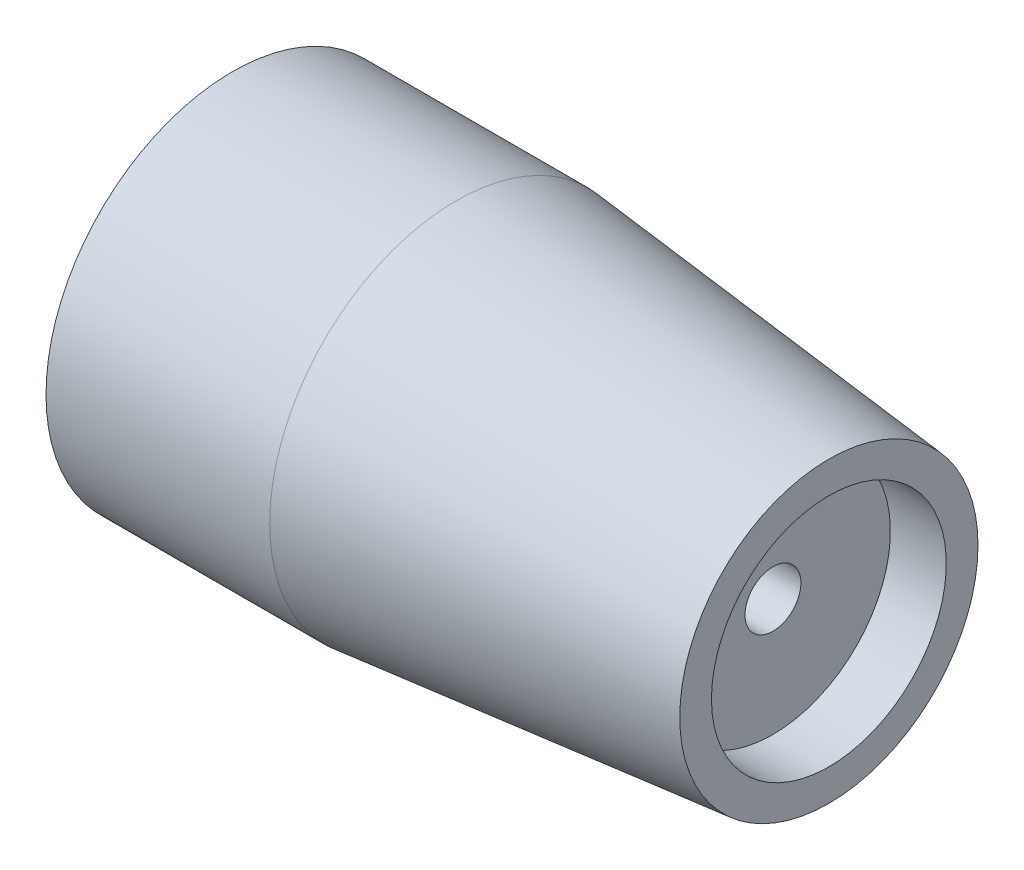
ISO-10303-21;
HEADER;
FILE_DESCRIPTION(('STEP AP214'),'2;1');
FILE_NAME('part.step','',(''),(''),'','','');
FILE_SCHEMA(('AUTOMOTIVE_DESIGN { 1 0 10303 214 1 1 1 1 }'));
ENDSEC;
DATA;
#1=APPLICATION_CONTEXT('core data for automotive mechanical design processes');
#2=APPLICATION_PROTOCOL_DEFINITION('international standard','automotive_design',2000,#1);
#3=PRODUCT_CONTEXT('',#1,'mechanical');
#4=PRODUCT('Part','Part','',(#3));
#5=PRODUCT_RELATED_PRODUCT_CATEGORY('part','',(#4));
#6=PRODUCT_DEFINITION_FORMATION('','',#4);
#7=PRODUCT_DEFINITION_CONTEXT('part definition',#1,'design');
#8=PRODUCT_DEFINITION('design','',#6,#7);
#9=PRODUCT_DEFINITION_SHAPE('','',#8);
#10=(LENGTH_UNIT() NAMED_UNIT(*) SI_UNIT(.MILLI.,.METRE.));
#11=(NAMED_UNIT(*) PLANE_ANGLE_UNIT() SI_UNIT($,.RADIAN.));
#12=(NAMED_UNIT(*) SI_UNIT($,.STERADIAN.) SOLID_ANGLE_UNIT());
#13=UNCERTAINTY_MEASURE_WITH_UNIT(LENGTH_MEASURE(1.E-05),#10,'distance_accuracy_value','');
#14=(GEOMETRIC_REPRESENTATION_CONTEXT(3) GLOBAL_UNCERTAINTY_ASSIGNED_CONTEXT((#13)) GLOBAL_UNIT_ASSIGNED_CONTEXT((#10,
#11,#12)) REPRESENTATION_CONTEXT('',''));
#15=CARTESIAN_POINT('',(0.,0.,0.));
#16=DIRECTION('',(0.,0.,1.));
#17=DIRECTION('',(1.,0.,0.));
#18=AXIS2_PLACEMENT_3D('',#15,#16,#17);
#19=CARTESIAN_POINT('',(-7.,0.,0.));
#20=DIRECTION('',(1.,0.,0.));
#21=DIRECTION('',(0.,0.,-1.));
#22=AXIS2_PLACEMENT_3D('',#19,#20,#21);
#23=CYLINDRICAL_SURFACE('',#22,0.75);
#24=CARTESIAN_POINT('',(7.5,0.,0.));
#25=DIRECTION('',(1.,0.,0.));
#26=DIRECTION('',(0.,0.,-1.));
#27=AXIS2_PLACEMENT_3D('',#24,#25,#26);
#28=CIRCLE('',#27,0.75);
#29=CARTESIAN_POINT('',(7.5,0.,-0.75));
#30=VERTEX_POINT('',#29);
#31=EDGE_CURVE('E74',#30,#30,#28,.T.);
#32=CARTESIAN_POINT('',(0.2,0.,0.));
#33=DIRECTION('',(-1.,0.,0.));
#34=DIRECTION('',(0.,0.,1.));
#35=AXIS2_PLACEMENT_3D('',#32,#33,#34);
#36=CIRCLE('',#35,0.75);
#37=CARTESIAN_POINT('',(0.2,0.,-0.75));
#38=VERTEX_POINT('',#37);
#39=EDGE_CURVE('E10',#38,#38,#36,.F.);
#40=CARTESIAN_POINT('',(7.5,0.,-0.75));
#41=CARTESIAN_POINT('',(7.42395833333333,0.,-0.75));
#42=CARTESIAN_POINT('',(7.34791666666667,0.,-0.75));
#43=CARTESIAN_POINT('',(7.19583333333333,0.,-0.75));
#44=CARTESIAN_POINT('',(7.11979166666667,0.,-0.75));
#45=CARTESIAN_POINT('',(6.96770833333333,0.,-0.75));
#46=CARTESIAN_POINT('',(6.89166666666667,0.,-0.75));
#47=CARTESIAN_POINT('',(6.73958333333333,0.,-0.75));
#48=CARTESIAN_POINT('',(6.66354166666667,0.,-0.75));
#49=CARTESIAN_POINT('',(6.51145833333333,0.,-0.75));
#50=CARTESIAN_POINT('',(6.43541666666667,0.,-0.75));
#51=CARTESIAN_POINT('',(6.28333333333333,0.,-0.75));
#52=CARTESIAN_POINT('',(6.20729166666667,0.,-0.75));
#53=CARTESIAN_POINT('',(6.05520833333333,0.,-0.75));
#54=CARTESIAN_POINT('',(5.97916666666667,0.,-0.75));
#55=CARTESIAN_POINT('',(5.82708333333333,0.,-0.75));
#56=CARTESIAN_POINT('',(5.75104166666667,0.,-0.75));
#57=CARTESIAN_POINT('',(5.59895833333333,0.,-0.75));
#58=CARTESIAN_POINT('',(5.52291666666667,0.,-0.75));
#59=CARTESIAN_POINT('',(5.37083333333333,0.,-0.75));
#60=CARTESIAN_POINT('',(5.29479166666667,0.,-0.75));
#61=CARTESIAN_POINT('',(5.14270833333333,0.,-0.75));
#62=CARTESIAN_POINT('',(5.06666666666667,0.,-0.75));
#63=CARTESIAN_POINT('',(4.91458333333333,0.,-0.75));
#64=CARTESIAN_POINT('',(4.83854166666667,0.,-0.75));
#65=CARTESIAN_POINT('',(4.68645833333333,0.,-0.75));
#66=CARTESIAN_POINT('',(4.61041666666667,0.,-0.75));
#67=CARTESIAN_POINT('',(4.45833333333333,0.,-0.75));
#68=CARTESIAN_POINT('',(4.38229166666667,0.,-0.75));
#69=CARTESIAN_POINT('',(4.23020833333333,0.,-0.75));
#70=CARTESIAN_POINT('',(4.15416666666667,0.,-0.75));
#71=CARTESIAN_POINT('',(4.00208333333333,0.,-0.75));
#72=CARTESIAN_POINT('',(3.92604166666667,0.,-0.75));
#73=CARTESIAN_POINT('',(3.77395833333333,0.,-0.75));
#74=CARTESIAN_POINT('',(3.69791666666667,0.,-0.75));
#75=CARTESIAN_POINT('',(3.54583333333333,0.,-0.75));
#76=CARTESIAN_POINT('',(3.46979166666667,0.,-0.75));
#77=CARTESIAN_POINT('',(3.31770833333333,0.,-0.75));
#78=CARTESIAN_POINT('',(3.24166666666667,0.,-0.75));
#79=CARTESIAN_POINT('',(3.08958333333333,0.,-0.75));
#80=CARTESIAN_POINT('',(3.01354166666667,0.,-0.75));
#81=CARTESIAN_POINT('',(2.86145833333333,0.,-0.75));
#82=CARTESIAN_POINT('',(2.78541666666667,0.,-0.75));
#83=CARTESIAN_POINT('',(2.63333333333333,0.,-0.75));
#84=CARTESIAN_POINT('',(2.55729166666667,0.,-0.75));
#85=CARTESIAN_POINT('',(2.40520833333333,0.,-0.75));
#86=CARTESIAN_POINT('',(2.32916666666667,0.,-0.75));
#87=CARTESIAN_POINT('',(2.17708333333333,0.,-0.75));
#88=CARTESIAN_POINT('',(2.10104166666667,0.,-0.75));
#89=CARTESIAN_POINT('',(1.94895833333333,0.,-0.75));
#90=CARTESIAN_POINT('',(1.87291666666667,0.,-0.75));
#91=CARTESIAN_POINT('',(1.72083333333333,0.,-0.75));
#92=CARTESIAN_POINT('',(1.64479166666667,0.,-0.75));
#93=CARTESIAN_POINT('',(1.49270833333333,0.,-0.75));
#94=CARTESIAN_POINT('',(1.41666666666666,0.,-0.75));
#95=CARTESIAN_POINT('',(1.26458333333333,0.,-0.75));
#96=CARTESIAN_POINT('',(1.18854166666667,0.,-0.75));
#97=CARTESIAN_POINT('',(1.03645833333333,0.,-0.75));
#98=CARTESIAN_POINT('',(0.960416666666666,0.,-0.75));
#99=CARTESIAN_POINT('',(0.808333333333333,0.,-0.75));
#100=CARTESIAN_POINT('',(0.732291666666666,0.,-0.75));
#101=CARTESIAN_POINT('',(0.580208333333333,0.,-0.75));
#102=CARTESIAN_POINT('',(0.504166666666666,0.,-0.75));
#103=CARTESIAN_POINT('',(0.352083333333333,0.,-0.75));
#104=CARTESIAN_POINT('',(0.276041666666666,0.,-0.75));
#105=CARTESIAN_POINT('',(0.2,0.,-0.75));
#106=B_SPLINE_CURVE_WITH_KNOTS('',3,(#40,#41,#42,#43,#44,#45,#46,#47,#48,#49,#50,#51,#52,#53,
#54,#55,#56,#57,#58,#59,#60,#61,#62,#63,#64,#65,#66,#67,#68,#69,#70,#71,#72,#73,#74,#75,#76,#77,
#78,#79,#80,#81,#82,#83,#84,#85,#86,#87,#88,#89,#90,#91,#92,#93,#94,#95,#96,#97,#98,#99,#100,
#101,#102,#103,#104,#105),.UNSPECIFIED.,.F.,.F.,(4,2,2,2,2,2,2,2,2,2,2,2,2,2,2,2,2,2,2,2,2,2,2,
2,2,2,2,2,2,2,2,2,4),(0.,0.228124999999999,0.45625,0.684375000000001,0.9125,1.140625,1.36875,
1.596875,1.825,2.053125,2.28125,2.509375,2.7375,2.965625,3.19375,3.421875,3.65,3.878125,4.10625,
4.334375,4.5625,4.790625,5.01875,5.246875,5.475,5.703125,5.93125,6.159375,6.3875,6.615625,
6.84375,7.071875,7.3),.UNSPECIFIED.);
#107=EDGE_CURVE('BSEAM41',#30,#38,#106,.T.);
#108=ORIENTED_EDGE('',*,*,#31,.T.);
#109=ORIENTED_EDGE('',*,*,#39,.F.);
#110=ORIENTED_EDGE('',*,*,#107,.T.);
#111=ORIENTED_EDGE('',*,*,#107,.F.);
#112=EDGE_LOOP('',(#108,#110,#109,#111));
#113=FACE_BOUND('',#112,.T.);
#114=ADVANCED_FACE('F41',(#113),#23,.F.);
#115=CARTESIAN_POINT('',(7.5,0.,0.));
#116=DIRECTION('',(-1.,0.,0.));
#117=DIRECTION('',(0.,0.,1.));
#118=AXIS2_PLACEMENT_3D('',#115,#116,#117);
#119=PLANE('',#118);
#120=ORIENTED_EDGE('',*,*,#31,.F.);
#121=EDGE_LOOP('',(#120));
#122=FACE_BOUND('',#121,.T.);
#123=CARTESIAN_POINT('',(7.5,0.,0.));
#124=DIRECTION('',(-1.,0.,0.));
#125=DIRECTION('',(0.,0.,1.));
#126=AXIS2_PLACEMENT_3D('',#123,#124,#125);
#127=CIRCLE('',#126,3.15);
#128=CARTESIAN_POINT('',(7.5,0.,3.15));
#129=VERTEX_POINT('',#128);
#130=EDGE_CURVE('E48',#129,#129,#127,.T.);
#131=ORIENTED_EDGE('',*,*,#130,.F.);
#132=EDGE_LOOP('',(#131));
#133=FACE_BOUND('',#132,.T.);
#134=ADVANCED_FACE('F43',(#122,#133),#119,.F.);
#135=CARTESIAN_POINT('',(0.,0.,0.));
#136=DIRECTION('',(-1.,0.,0.));
#137=DIRECTION('',(0.,0.,1.));
#138=AXIS2_PLACEMENT_3D('',#135,#136,#137);
#139=CYLINDRICAL_SURFACE('',#138,3.15);
#140=CARTESIAN_POINT('',(9.,0.,0.));
#141=DIRECTION('',(-1.,0.,0.));
#142=DIRECTION('',(0.,0.,1.));
#143=AXIS2_PLACEMENT_3D('',#140,#141,#142);
#144=CIRCLE('',#143,3.15);
#145=CARTESIAN_POINT('',(9.,0.,3.15));
#146=VERTEX_POINT('',#145);
#147=EDGE_CURVE('E52',#146,#146,#144,.T.);
#148=ORIENTED_EDGE('',*,*,#147,.F.);
#149=EDGE_LOOP('',(#148));
#150=FACE_BOUND('',#149,.T.);
#151=ORIENTED_EDGE('',*,*,#130,.T.);
#152=EDGE_LOOP('',(#151));
#153=FACE_BOUND('',#152,.T.);
#154=ADVANCED_FACE('F82',(#150,#153),#139,.F.);
#155=CARTESIAN_POINT('',(9.,3.15,0.));
#156=DIRECTION('',(-1.,0.,0.));
#157=DIRECTION('',(0.,0.,1.));
#158=AXIS2_PLACEMENT_3D('',#155,#156,#157);
#159=PLANE('',#158);
#160=CARTESIAN_POINT('',(9.,0.,0.));
#161=DIRECTION('',(-1.,0.,0.));
#162=DIRECTION('',(0.,0.,1.));
#163=AXIS2_PLACEMENT_3D('',#160,#161,#162);
#164=CIRCLE('',#163,4.);
#165=CARTESIAN_POINT('',(9.,0.,4.));
#166=VERTEX_POINT('',#165);
#167=EDGE_CURVE('E56',#166,#166,#164,.T.);
#168=ORIENTED_EDGE('',*,*,#167,.F.);
#169=EDGE_LOOP('',(#168));
#170=FACE_BOUND('',#169,.T.);
#171=ORIENTED_EDGE('',*,*,#147,.T.);
#172=EDGE_LOOP('',(#171));
#173=FACE_BOUND('',#172,.T.);
#174=ADVANCED_FACE('F86',(#170,#173),#159,.F.);
#175=CARTESIAN_POINT('',(9.,0.,0.));
#176=DIRECTION('',(-1.,0.,0.));
#177=DIRECTION('',(0.,0.,1.));
#178=AXIS2_PLACEMENT_3D('',#175,#176,#177);
#179=CONICAL_SURFACE('',#178,4.,0.0996686524911619);
#180=CARTESIAN_POINT('',(-1.,0.,0.));
#181=DIRECTION('',(-1.,0.,0.));
#182=DIRECTION('',(0.,0.,1.));
#183=AXIS2_PLACEMENT_3D('',#180,#181,#182);
#184=CIRCLE('',#183,5.);
#185=CARTESIAN_POINT('',(-1.,0.,5.));
#186=VERTEX_POINT('',#185);
#187=EDGE_CURVE('E61',#186,#186,#184,.T.);
#188=ORIENTED_EDGE('',*,*,#187,.F.);
#189=EDGE_LOOP('',(#188));
#190=FACE_BOUND('',#189,.T.);
#191=ORIENTED_EDGE('',*,*,#167,.T.);
#192=EDGE_LOOP('',(#191));
#193=FACE_BOUND('',#192,.T.);
#194=ADVANCED_FACE('F110',(#190,#193),#179,.T.);
#195=CARTESIAN_POINT('',(0.,0.,0.));
#196=DIRECTION('',(-1.,0.,0.));
#197=DIRECTION('',(0.,0.,1.));
#198=AXIS2_PLACEMENT_3D('',#195,#196,#197);
#199=CYLINDRICAL_SURFACE('',#198,5.);
#200=CARTESIAN_POINT('',(-7.,0.,0.));
#201=DIRECTION('',(-1.,0.,0.));
#202=DIRECTION('',(0.,0.,1.));
#203=AXIS2_PLACEMENT_3D('',#200,#201,#202);
#204=CIRCLE('',#203,5.);
#205=CARTESIAN_POINT('',(-7.,0.,5.));
#206=VERTEX_POINT('',#205);
#207=EDGE_CURVE('E64',#206,#206,#204,.T.);
#208=ORIENTED_EDGE('',*,*,#207,.F.);
#209=EDGE_LOOP('',(#208));
#210=FACE_BOUND('',#209,.T.);
#211=ORIENTED_EDGE('',*,*,#187,.T.);
#212=EDGE_LOOP('',(#211));
#213=FACE_BOUND('',#212,.T.);
#214=ADVANCED_FACE('F106',(#210,#213),#199,.T.);
#215=CARTESIAN_POINT('',(-7.,5.,0.));
#216=DIRECTION('',(1.,0.,0.));
#217=DIRECTION('',(0.,0.,-1.));
#218=AXIS2_PLACEMENT_3D('',#215,#216,#217);
#219=PLANE('',#218);
#220=CARTESIAN_POINT('',(-7.,0.,0.));
#221=DIRECTION('',(-1.,0.,0.));
#222=DIRECTION('',(0.,0.,1.));
#223=AXIS2_PLACEMENT_3D('',#220,#221,#222);
#224=CIRCLE('',#223,2.3);
#225=CARTESIAN_POINT('',(-7.,0.,2.3));
#226=VERTEX_POINT('',#225);
#227=EDGE_CURVE('E67',#226,#226,#224,.T.);
#228=ORIENTED_EDGE('',*,*,#227,.F.);
#229=EDGE_LOOP('',(#228));
#230=FACE_BOUND('',#229,.T.);
#231=ORIENTED_EDGE('',*,*,#207,.T.);
#232=EDGE_LOOP('',(#231));
#233=FACE_BOUND('',#232,.T.);
#234=ADVANCED_FACE('F102',(#230,#233),#219,.F.);
#235=CARTESIAN_POINT('',(0.,0.,0.));
#236=DIRECTION('',(-1.,0.,0.));
#237=DIRECTION('',(0.,0.,1.));
#238=AXIS2_PLACEMENT_3D('',#235,#236,#237);
#239=CYLINDRICAL_SURFACE('',#238,2.3);
#240=CARTESIAN_POINT('',(0.,0.,0.));
#241=DIRECTION('',(-1.,0.,0.));
#242=DIRECTION('',(0.,0.,1.));
#243=AXIS2_PLACEMENT_3D('',#240,#241,#242);
#244=CIRCLE('',#243,2.3);
#245=CARTESIAN_POINT('',(0.,0.,2.3));
#246=VERTEX_POINT('',#245);
#247=EDGE_CURVE('E70',#246,#246,#244,.T.);
#248=ORIENTED_EDGE('',*,*,#247,.F.);
#249=EDGE_LOOP('',(#248));
#250=FACE_BOUND('',#249,.T.);
#251=ORIENTED_EDGE('',*,*,#227,.T.);
#252=EDGE_LOOP('',(#251));
#253=FACE_BOUND('',#252,.T.);
#254=ADVANCED_FACE('F98',(#250,#253),#239,.F.);
#255=CARTESIAN_POINT('',(0.,2.3,0.));
#256=DIRECTION('',(1.,0.,0.));
#257=DIRECTION('',(0.,0.,-1.));
#258=AXIS2_PLACEMENT_3D('',#255,#256,#257);
#259=PLANE('',#258);
#260=ORIENTED_EDGE('',*,*,#247,.T.);
#261=EDGE_LOOP('',(#260));
#262=FACE_BOUND('',#261,.T.);
#263=ADVANCED_FACE('F96',(#262),#259,.F.);
#264=CARTESIAN_POINT('',(0.2,0.,0.));
#265=DIRECTION('',(-1.,0.,0.));
#266=DIRECTION('',(0.,0.,1.));
#267=AXIS2_PLACEMENT_3D('',#264,#265,#266);
#268=PLANE('',#267);
#269=ORIENTED_EDGE('',*,*,#39,.T.);
#270=EDGE_LOOP('',(#269));
#271=FACE_BOUND('',#270,.T.);
#272=ADVANCED_FACE('F95',(#271),#268,.F.);
#273=CLOSED_SHELL('',(#114,#134,#154,#174,#194,#214,#234,#254,#263,#272));
#274=MANIFOLD_SOLID_BREP('B2',#273);
#275=ADVANCED_BREP_SHAPE_REPRESENTATION('',(#18,#274),#14);
#276=SHAPE_DEFINITION_REPRESENTATION(#9,#275);
ENDSEC;
END-ISO-10303-21;
